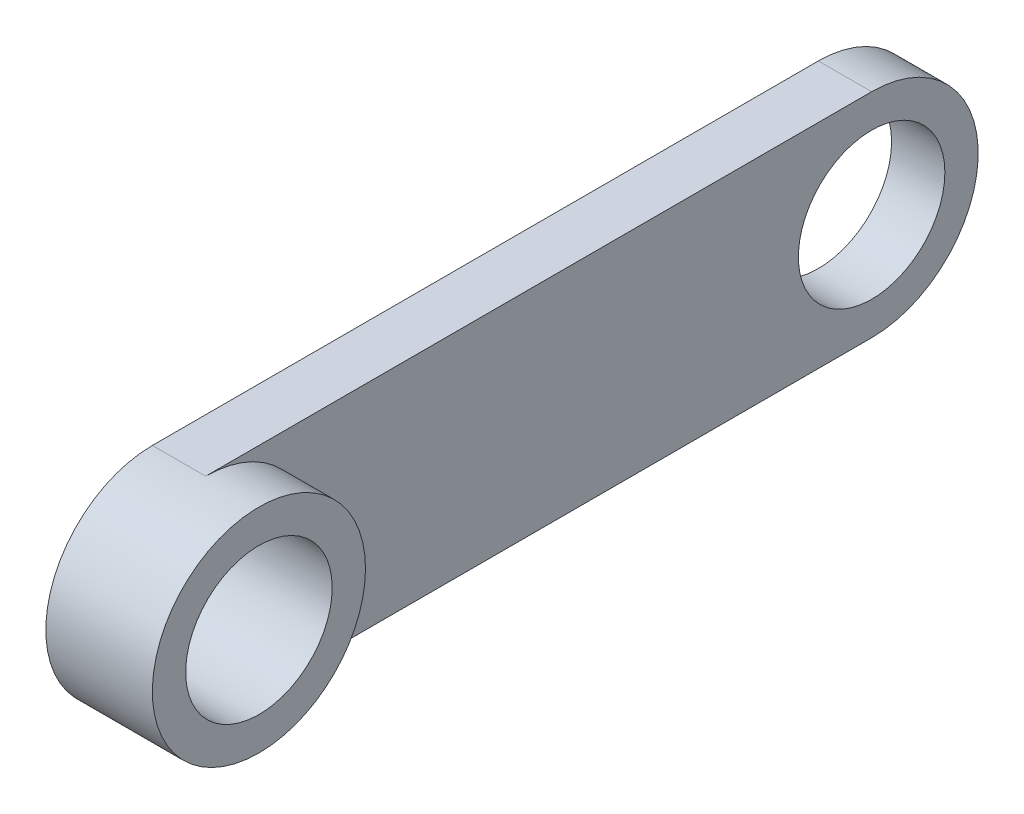
ISO-10303-21;
HEADER;
FILE_DESCRIPTION(('STEP AP214'),'2;1');
FILE_NAME('part.step','',(''),(''),'','','');
FILE_SCHEMA(('AUTOMOTIVE_DESIGN { 1 0 10303 214 1 1 1 1 }'));
ENDSEC;
DATA;
#1=APPLICATION_CONTEXT('core data for automotive mechanical design processes');
#2=APPLICATION_PROTOCOL_DEFINITION('international standard','automotive_design',2000,#1);
#3=PRODUCT_CONTEXT('',#1,'mechanical');
#4=PRODUCT('Part','Part','',(#3));
#5=PRODUCT_RELATED_PRODUCT_CATEGORY('part','',(#4));
#6=PRODUCT_DEFINITION_FORMATION('','',#4);
#7=PRODUCT_DEFINITION_CONTEXT('part definition',#1,'design');
#8=PRODUCT_DEFINITION('design','',#6,#7);
#9=PRODUCT_DEFINITION_SHAPE('','',#8);
#10=(LENGTH_UNIT() NAMED_UNIT(*) SI_UNIT(.MILLI.,.METRE.));
#11=(NAMED_UNIT(*) PLANE_ANGLE_UNIT() SI_UNIT($,.RADIAN.));
#12=(NAMED_UNIT(*) SI_UNIT($,.STERADIAN.) SOLID_ANGLE_UNIT());
#13=UNCERTAINTY_MEASURE_WITH_UNIT(LENGTH_MEASURE(1.E-05),#10,'distance_accuracy_value','');
#14=(GEOMETRIC_REPRESENTATION_CONTEXT(3) GLOBAL_UNCERTAINTY_ASSIGNED_CONTEXT((#13)) GLOBAL_UNIT_ASSIGNED_CONTEXT((#10,
#11,#12)) REPRESENTATION_CONTEXT('',''));
#15=CARTESIAN_POINT('',(0.,0.,0.));
#16=DIRECTION('',(0.,0.,1.));
#17=DIRECTION('',(1.,0.,0.));
#18=AXIS2_PLACEMENT_3D('',#15,#16,#17);
#19=CARTESIAN_POINT('',(2.,4.,-29.));
#20=DIRECTION('',(1.,0.,0.));
#21=DIRECTION('',(0.,0.,-1.));
#22=AXIS2_PLACEMENT_3D('',#19,#20,#21);
#23=PLANE('',#22);
#24=CARTESIAN_POINT('',(2.,4.,-29.));
#25=DIRECTION('',(1.,0.,0.));
#26=DIRECTION('',(0.,0.,-1.));
#27=AXIS2_PLACEMENT_3D('',#24,#25,#26);
#28=CIRCLE('',#27,2.75);
#29=CARTESIAN_POINT('',(2.,4.,-31.75));
#30=VERTEX_POINT('',#29);
#31=EDGE_CURVE('E120',#30,#30,#28,.T.);
#32=ORIENTED_EDGE('',*,*,#31,.F.);
#33=EDGE_LOOP('',(#32));
#34=FACE_BOUND('',#33,.T.);
#35=DIRECTION('',(0.,0.,1.));
#36=VECTOR('',#35,1.);
#37=CARTESIAN_POINT('',(2.,8.,-4.));
#38=LINE('',#37,#36);
#39=CARTESIAN_POINT('',(2.,8.,-29.));
#40=VERTEX_POINT('',#39);
#41=CARTESIAN_POINT('',(2.,8.,-4.));
#42=VERTEX_POINT('',#41);
#43=EDGE_CURVE('E89',#40,#42,#38,.T.);
#44=ORIENTED_EDGE('',*,*,#43,.T.);
#45=CARTESIAN_POINT('',(2.,4.,-4.));
#46=DIRECTION('',(1.,0.,0.));
#47=DIRECTION('',(0.,0.,-1.));
#48=AXIS2_PLACEMENT_3D('',#45,#46,#47);
#49=CIRCLE('',#48,4.);
#50=CARTESIAN_POINT('',(2.,0.,-4.));
#51=VERTEX_POINT('',#50);
#52=EDGE_CURVE('E92',#42,#51,#49,.F.);
#53=ORIENTED_EDGE('',*,*,#52,.T.);
#54=DIRECTION('',(0.,0.,-1.));
#55=VECTOR('',#54,1.);
#56=CARTESIAN_POINT('',(2.,0.,-4.));
#57=LINE('',#56,#55);
#58=CARTESIAN_POINT('',(2.,0.,-29.));
#59=VERTEX_POINT('',#58);
#60=EDGE_CURVE('E60',#51,#59,#57,.T.);
#61=ORIENTED_EDGE('',*,*,#60,.T.);
#62=CARTESIAN_POINT('',(2.,4.,-29.));
#63=DIRECTION('',(1.,0.,0.));
#64=DIRECTION('',(0.,0.,-1.));
#65=AXIS2_PLACEMENT_3D('',#62,#63,#64);
#66=CIRCLE('',#65,4.);
#67=EDGE_CURVE('E100',#59,#40,#66,.T.);
#68=ORIENTED_EDGE('',*,*,#67,.T.);
#69=EDGE_LOOP('',(#44,#53,#61,#68));
#70=FACE_BOUND('',#69,.T.);
#71=ADVANCED_FACE('F43',(#34,#70),#23,.T.);
#72=CARTESIAN_POINT('',(0.,4.,-29.));
#73=DIRECTION('',(1.,0.,0.));
#74=DIRECTION('',(0.,0.,-1.));
#75=AXIS2_PLACEMENT_3D('',#72,#73,#74);
#76=PLANE('',#75);
#77=CARTESIAN_POINT('',(0.,4.,-4.));
#78=DIRECTION('',(1.,0.,0.));
#79=DIRECTION('',(0.,0.,-1.));
#80=AXIS2_PLACEMENT_3D('',#77,#78,#79);
#81=CIRCLE('',#80,4.);
#82=CARTESIAN_POINT('',(0.,8.,-4.));
#83=VERTEX_POINT('',#82);
#84=CARTESIAN_POINT('',(0.,0.,-4.));
#85=VERTEX_POINT('',#84);
#86=EDGE_CURVE('E78',#83,#85,#81,.T.);
#87=ORIENTED_EDGE('',*,*,#86,.F.);
#88=DIRECTION('',(0.,0.,1.));
#89=VECTOR('',#88,1.);
#90=CARTESIAN_POINT('',(0.,8.,-4.));
#91=LINE('',#90,#89);
#92=CARTESIAN_POINT('',(0.,8.,-29.));
#93=VERTEX_POINT('',#92);
#94=EDGE_CURVE('E104',#93,#83,#91,.T.);
#95=ORIENTED_EDGE('',*,*,#94,.F.);
#96=CARTESIAN_POINT('',(0.,4.,-29.));
#97=DIRECTION('',(1.,0.,0.));
#98=DIRECTION('',(0.,0.,-1.));
#99=AXIS2_PLACEMENT_3D('',#96,#97,#98);
#100=CIRCLE('',#99,4.);
#101=CARTESIAN_POINT('',(0.,0.,-29.));
#102=VERTEX_POINT('',#101);
#103=EDGE_CURVE('E112',#102,#93,#100,.T.);
#104=ORIENTED_EDGE('',*,*,#103,.F.);
#105=DIRECTION('',(0.,0.,-1.));
#106=VECTOR('',#105,1.);
#107=CARTESIAN_POINT('',(0.,0.,-4.));
#108=LINE('',#107,#106);
#109=EDGE_CURVE('E83',#85,#102,#108,.T.);
#110=ORIENTED_EDGE('',*,*,#109,.F.);
#111=EDGE_LOOP('',(#87,#95,#104,#110));
#112=FACE_BOUND('',#111,.T.);
#113=CARTESIAN_POINT('',(0.,4.,-4.));
#114=DIRECTION('',(1.,0.,0.));
#115=DIRECTION('',(0.,0.,-1.));
#116=AXIS2_PLACEMENT_3D('',#113,#114,#115);
#117=CIRCLE('',#116,2.75);
#118=CARTESIAN_POINT('',(0.,4.,-6.75));
#119=VERTEX_POINT('',#118);
#120=EDGE_CURVE('E115',#119,#119,#117,.T.);
#121=ORIENTED_EDGE('',*,*,#120,.T.);
#122=EDGE_LOOP('',(#121));
#123=FACE_BOUND('',#122,.T.);
#124=CARTESIAN_POINT('',(0.,4.,-29.));
#125=DIRECTION('',(1.,0.,0.));
#126=DIRECTION('',(0.,0.,-1.));
#127=AXIS2_PLACEMENT_3D('',#124,#125,#126);
#128=CIRCLE('',#127,2.75);
#129=CARTESIAN_POINT('',(0.,4.,-31.75));
#130=VERTEX_POINT('',#129);
#131=EDGE_CURVE('E96',#130,#130,#128,.T.);
#132=ORIENTED_EDGE('',*,*,#131,.T.);
#133=EDGE_LOOP('',(#132));
#134=FACE_BOUND('',#133,.T.);
#135=ADVANCED_FACE('F145',(#112,#123,#134),#76,.F.);
#136=CARTESIAN_POINT('',(2.,4.,-29.));
#137=DIRECTION('',(-1.,0.,0.));
#138=DIRECTION('',(0.,0.,1.));
#139=AXIS2_PLACEMENT_3D('',#136,#137,#138);
#140=CYLINDRICAL_SURFACE('',#139,4.);
#141=ORIENTED_EDGE('',*,*,#103,.T.);
#142=DIRECTION('',(-1.,0.,0.));
#143=VECTOR('',#142,1.);
#144=CARTESIAN_POINT('',(2.,8.,-29.));
#145=LINE('',#144,#143);
#146=EDGE_CURVE('E11',#40,#93,#145,.T.);
#147=ORIENTED_EDGE('',*,*,#146,.F.);
#148=ORIENTED_EDGE('',*,*,#67,.F.);
#149=DIRECTION('',(-1.,0.,0.));
#150=VECTOR('',#149,1.);
#151=CARTESIAN_POINT('',(2.,0.,-29.));
#152=LINE('',#151,#150);
#153=EDGE_CURVE('E105',#59,#102,#152,.T.);
#154=ORIENTED_EDGE('',*,*,#153,.T.);
#155=EDGE_LOOP('',(#141,#147,#148,#154));
#156=FACE_BOUND('',#155,.T.);
#157=ADVANCED_FACE('F45',(#156),#140,.T.);
#158=CARTESIAN_POINT('',(2.,8.,-4.));
#159=DIRECTION('',(0.,-1.,0.));
#160=DIRECTION('',(0.,0.,-1.));
#161=AXIS2_PLACEMENT_3D('',#158,#159,#160);
#162=PLANE('',#161);
#163=ORIENTED_EDGE('',*,*,#94,.T.);
#164=DIRECTION('',(-1.,0.,0.));
#165=VECTOR('',#164,1.);
#166=CARTESIAN_POINT('',(2.,8.,-4.));
#167=LINE('',#166,#165);
#168=EDGE_CURVE('E52',#42,#83,#167,.T.);
#169=ORIENTED_EDGE('',*,*,#168,.F.);
#170=ORIENTED_EDGE('',*,*,#43,.F.);
#171=ORIENTED_EDGE('',*,*,#146,.T.);
#172=EDGE_LOOP('',(#163,#169,#170,#171));
#173=FACE_BOUND('',#172,.T.);
#174=ADVANCED_FACE('F103',(#173),#162,.F.);
#175=CARTESIAN_POINT('',(2.,4.,-4.));
#176=DIRECTION('',(-1.,0.,0.));
#177=DIRECTION('',(0.,0.,1.));
#178=AXIS2_PLACEMENT_3D('',#175,#176,#177);
#179=CYLINDRICAL_SURFACE('',#178,4.);
#180=ORIENTED_EDGE('',*,*,#86,.T.);
#181=DIRECTION('',(-1.,0.,0.));
#182=VECTOR('',#181,1.);
#183=CARTESIAN_POINT('',(2.,0.,-4.));
#184=LINE('',#183,#182);
#185=EDGE_CURVE('E95',#51,#85,#184,.T.);
#186=ORIENTED_EDGE('',*,*,#185,.F.);
#187=ORIENTED_EDGE('',*,*,#52,.F.);
#188=ORIENTED_EDGE('',*,*,#168,.T.);
#189=EDGE_LOOP('',(#180,#186,#187,#188));
#190=FACE_BOUND('',#189,.T.);
#191=CARTESIAN_POINT('',(4.,4.,-4.));
#192=DIRECTION('',(1.,0.,0.));
#193=DIRECTION('',(0.,0.,-1.));
#194=AXIS2_PLACEMENT_3D('',#191,#192,#193);
#195=CIRCLE('',#194,4.);
#196=CARTESIAN_POINT('',(4.,4.,-8.));
#197=VERTEX_POINT('',#196);
#198=EDGE_CURVE('E97',#197,#197,#195,.T.);
#199=ORIENTED_EDGE('',*,*,#198,.F.);
#200=EDGE_LOOP('',(#199));
#201=FACE_BOUND('',#200,.T.);
#202=ADVANCED_FACE('F93',(#190,#201),#179,.T.);
#203=CARTESIAN_POINT('',(2.,0.,-4.));
#204=DIRECTION('',(0.,1.,0.));
#205=DIRECTION('',(0.,0.,1.));
#206=AXIS2_PLACEMENT_3D('',#203,#204,#205);
#207=PLANE('',#206);
#208=ORIENTED_EDGE('',*,*,#109,.T.);
#209=ORIENTED_EDGE('',*,*,#153,.F.);
#210=ORIENTED_EDGE('',*,*,#60,.F.);
#211=ORIENTED_EDGE('',*,*,#185,.T.);
#212=EDGE_LOOP('',(#208,#209,#210,#211));
#213=FACE_BOUND('',#212,.T.);
#214=ADVANCED_FACE('F156',(#213),#207,.F.);
#215=CARTESIAN_POINT('',(2.,4.,-4.));
#216=DIRECTION('',(-1.,0.,0.));
#217=DIRECTION('',(0.,0.,1.));
#218=AXIS2_PLACEMENT_3D('',#215,#216,#217);
#219=CYLINDRICAL_SURFACE('',#218,2.75);
#220=ORIENTED_EDGE('',*,*,#120,.F.);
#221=EDGE_LOOP('',(#220));
#222=FACE_BOUND('',#221,.T.);
#223=CARTESIAN_POINT('',(4.,4.,-4.));
#224=DIRECTION('',(1.,0.,0.));
#225=DIRECTION('',(0.,0.,-1.));
#226=AXIS2_PLACEMENT_3D('',#223,#224,#225);
#227=CIRCLE('',#226,2.75);
#228=CARTESIAN_POINT('',(4.,4.,-6.75));
#229=VERTEX_POINT('',#228);
#230=EDGE_CURVE('E127',#229,#229,#227,.T.);
#231=ORIENTED_EDGE('',*,*,#230,.T.);
#232=EDGE_LOOP('',(#231));
#233=FACE_BOUND('',#232,.T.);
#234=ADVANCED_FACE('F131',(#222,#233),#219,.F.);
#235=CARTESIAN_POINT('',(2.,4.,-29.));
#236=DIRECTION('',(-1.,0.,0.));
#237=DIRECTION('',(0.,0.,1.));
#238=AXIS2_PLACEMENT_3D('',#235,#236,#237);
#239=CYLINDRICAL_SURFACE('',#238,2.75);
#240=ORIENTED_EDGE('',*,*,#31,.T.);
#241=EDGE_LOOP('',(#240));
#242=FACE_BOUND('',#241,.T.);
#243=ORIENTED_EDGE('',*,*,#131,.F.);
#244=EDGE_LOOP('',(#243));
#245=FACE_BOUND('',#244,.T.);
#246=ADVANCED_FACE('F135',(#242,#245),#239,.F.);
#247=CARTESIAN_POINT('',(4.,4.,-4.));
#248=DIRECTION('',(1.,0.,0.));
#249=DIRECTION('',(0.,0.,-1.));
#250=AXIS2_PLACEMENT_3D('',#247,#248,#249);
#251=PLANE('',#250);
#252=ORIENTED_EDGE('',*,*,#198,.T.);
#253=EDGE_LOOP('',(#252));
#254=FACE_BOUND('',#253,.T.);
#255=ORIENTED_EDGE('',*,*,#230,.F.);
#256=EDGE_LOOP('',(#255));
#257=FACE_BOUND('',#256,.T.);
#258=ADVANCED_FACE('F133',(#254,#257),#251,.T.);
#259=CLOSED_SHELL('',(#71,#135,#157,#174,#202,#214,#234,#246,#258));
#260=MANIFOLD_SOLID_BREP('B2',#259);
#261=ADVANCED_BREP_SHAPE_REPRESENTATION('',(#18,#260),#14);
#262=SHAPE_DEFINITION_REPRESENTATION(#9,#261);
ENDSEC;
END-ISO-10303-21;
